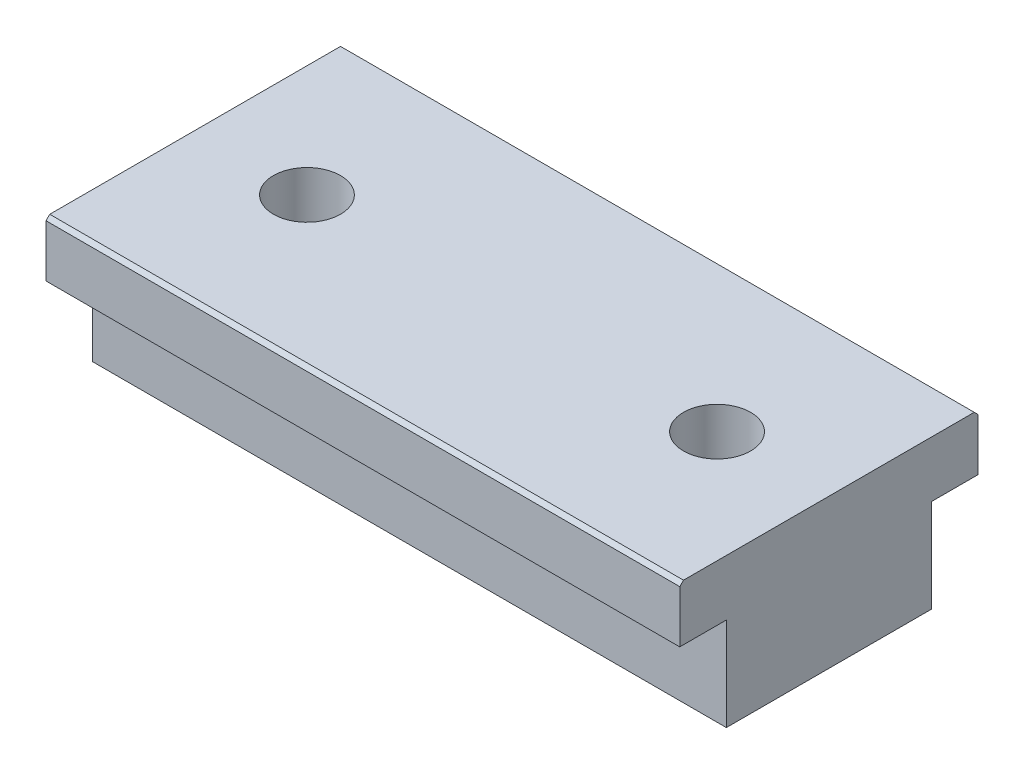
ISO-10303-21;
HEADER;
FILE_DESCRIPTION(('STEP AP214'),'2;1');
FILE_NAME('part.step','',(''),(''),'','','');
FILE_SCHEMA(('AUTOMOTIVE_DESIGN { 1 0 10303 214 1 1 1 1 }'));
ENDSEC;
DATA;
#1=APPLICATION_CONTEXT('core data for automotive mechanical design processes');
#2=APPLICATION_PROTOCOL_DEFINITION('international standard','automotive_design',2000,#1);
#3=PRODUCT_CONTEXT('',#1,'mechanical');
#4=PRODUCT('Part','Part','',(#3));
#5=PRODUCT_RELATED_PRODUCT_CATEGORY('part','',(#4));
#6=PRODUCT_DEFINITION_FORMATION('','',#4);
#7=PRODUCT_DEFINITION_CONTEXT('part definition',#1,'design');
#8=PRODUCT_DEFINITION('design','',#6,#7);
#9=PRODUCT_DEFINITION_SHAPE('','',#8);
#10=(LENGTH_UNIT() NAMED_UNIT(*) SI_UNIT(.MILLI.,.METRE.));
#11=(NAMED_UNIT(*) PLANE_ANGLE_UNIT() SI_UNIT($,.RADIAN.));
#12=(NAMED_UNIT(*) SI_UNIT($,.STERADIAN.) SOLID_ANGLE_UNIT());
#13=UNCERTAINTY_MEASURE_WITH_UNIT(LENGTH_MEASURE(1.E-05),#10,'distance_accuracy_value','');
#14=(GEOMETRIC_REPRESENTATION_CONTEXT(3) GLOBAL_UNCERTAINTY_ASSIGNED_CONTEXT((#13)) GLOBAL_UNIT_ASSIGNED_CONTEXT((#10,
#11,#12)) REPRESENTATION_CONTEXT('',''));
#15=CARTESIAN_POINT('',(0.,0.,0.));
#16=DIRECTION('',(0.,0.,1.));
#17=DIRECTION('',(1.,0.,0.));
#18=AXIS2_PLACEMENT_3D('',#15,#16,#17);
#19=CARTESIAN_POINT('',(170.,-15.,0.));
#20=DIRECTION('',(0.,0.,-1.));
#21=DIRECTION('',(-1.,0.,0.));
#22=AXIS2_PLACEMENT_3D('',#19,#20,#21);
#23=PLANE('',#22);
#24=DIRECTION('',(0.,-1.,0.));
#25=VECTOR('',#24,1.);
#26=CARTESIAN_POINT('',(170.,-15.,0.));
#27=LINE('',#26,#25);
#28=CARTESIAN_POINT('',(170.,-1.,0.));
#29=VERTEX_POINT('',#28);
#30=CARTESIAN_POINT('',(170.,-15.,0.));
#31=VERTEX_POINT('',#30);
#32=EDGE_CURVE('E112',#29,#31,#27,.T.);
#33=ORIENTED_EDGE('',*,*,#32,.F.);
#34=DIRECTION('',(-1.,0.,0.));
#35=VECTOR('',#34,1.);
#36=CARTESIAN_POINT('',(170.,-1.,0.));
#37=LINE('',#36,#35);
#38=CARTESIAN_POINT('',(0.,-1.,0.));
#39=VERTEX_POINT('',#38);
#40=EDGE_CURVE('E11',#29,#39,#37,.T.);
#41=ORIENTED_EDGE('',*,*,#40,.T.);
#42=DIRECTION('',(0.,-1.,0.));
#43=VECTOR('',#42,1.);
#44=CARTESIAN_POINT('',(0.,-15.,0.));
#45=LINE('',#44,#43);
#46=CARTESIAN_POINT('',(0.,-15.,0.));
#47=VERTEX_POINT('',#46);
#48=EDGE_CURVE('E132',#39,#47,#45,.T.);
#49=ORIENTED_EDGE('',*,*,#48,.T.);
#50=DIRECTION('',(-1.,0.,0.));
#51=VECTOR('',#50,1.);
#52=CARTESIAN_POINT('',(170.,-15.,0.));
#53=LINE('',#52,#51);
#54=EDGE_CURVE('E125',#31,#47,#53,.T.);
#55=ORIENTED_EDGE('',*,*,#54,.F.);
#56=EDGE_LOOP('',(#33,#41,#49,#55));
#57=FACE_BOUND('',#56,.T.);
#58=ADVANCED_FACE('F35',(#57),#23,.F.);
#59=CARTESIAN_POINT('',(170.,-15.,-12.5));
#60=DIRECTION('',(0.,1.,0.));
#61=DIRECTION('',(0.,0.,1.));
#62=AXIS2_PLACEMENT_3D('',#59,#60,#61);
#63=PLANE('',#62);
#64=DIRECTION('',(0.,0.,-1.));
#65=VECTOR('',#64,1.);
#66=CARTESIAN_POINT('',(0.,-15.,-12.5));
#67=LINE('',#66,#65);
#68=CARTESIAN_POINT('',(0.,-15.,-12.5));
#69=VERTEX_POINT('',#68);
#70=EDGE_CURVE('E198',#47,#69,#67,.T.);
#71=ORIENTED_EDGE('',*,*,#70,.T.);
#72=DIRECTION('',(-1.,0.,0.));
#73=VECTOR('',#72,1.);
#74=CARTESIAN_POINT('',(170.,-15.,-12.5));
#75=LINE('',#74,#73);
#76=CARTESIAN_POINT('',(170.,-15.,-12.5));
#77=VERTEX_POINT('',#76);
#78=EDGE_CURVE('E127',#77,#69,#75,.T.);
#79=ORIENTED_EDGE('',*,*,#78,.F.);
#80=DIRECTION('',(0.,0.,-1.));
#81=VECTOR('',#80,1.);
#82=CARTESIAN_POINT('',(170.,-15.,-12.5));
#83=LINE('',#82,#81);
#84=EDGE_CURVE('E115',#31,#77,#83,.T.);
#85=ORIENTED_EDGE('',*,*,#84,.F.);
#86=ORIENTED_EDGE('',*,*,#54,.T.);
#87=EDGE_LOOP('',(#71,#79,#85,#86));
#88=FACE_BOUND('',#87,.T.);
#89=ADVANCED_FACE('F124',(#88),#63,.F.);
#90=CARTESIAN_POINT('',(170.,-40.,-12.5));
#91=DIRECTION('',(0.,0.,-1.));
#92=DIRECTION('',(-1.,0.,0.));
#93=AXIS2_PLACEMENT_3D('',#90,#91,#92);
#94=PLANE('',#93);
#95=DIRECTION('',(0.,-1.,0.));
#96=VECTOR('',#95,1.);
#97=CARTESIAN_POINT('',(0.,-40.,-12.5));
#98=LINE('',#97,#96);
#99=CARTESIAN_POINT('',(0.,-40.,-12.5));
#100=VERTEX_POINT('',#99);
#101=EDGE_CURVE('E196',#69,#100,#98,.T.);
#102=ORIENTED_EDGE('',*,*,#101,.T.);
#103=DIRECTION('',(-1.,0.,0.));
#104=VECTOR('',#103,1.);
#105=CARTESIAN_POINT('',(170.,-40.,-12.5));
#106=LINE('',#105,#104);
#107=CARTESIAN_POINT('',(170.,-40.,-12.5));
#108=VERTEX_POINT('',#107);
#109=EDGE_CURVE('E138',#108,#100,#106,.T.);
#110=ORIENTED_EDGE('',*,*,#109,.F.);
#111=DIRECTION('',(0.,-1.,0.));
#112=VECTOR('',#111,1.);
#113=CARTESIAN_POINT('',(170.,-40.,-12.5));
#114=LINE('',#113,#112);
#115=EDGE_CURVE('E129',#77,#108,#114,.T.);
#116=ORIENTED_EDGE('',*,*,#115,.F.);
#117=ORIENTED_EDGE('',*,*,#78,.T.);
#118=EDGE_LOOP('',(#102,#110,#116,#117));
#119=FACE_BOUND('',#118,.T.);
#120=ADVANCED_FACE('F264',(#119),#94,.F.);
#121=CARTESIAN_POINT('',(170.,-40.,-67.5));
#122=DIRECTION('',(0.,1.,0.));
#123=DIRECTION('',(0.,0.,1.));
#124=AXIS2_PLACEMENT_3D('',#121,#122,#123);
#125=PLANE('',#124);
#126=CARTESIAN_POINT('',(30.,-40.,-40.));
#127=DIRECTION('',(0.,1.,0.));
#128=DIRECTION('',(0.,0.,1.));
#129=AXIS2_PLACEMENT_3D('',#126,#127,#128);
#130=CIRCLE('',#129,5.50000000000001);
#131=CARTESIAN_POINT('',(30.,-40.,-34.5));
#132=VERTEX_POINT('',#131);
#133=EDGE_CURVE('E222',#132,#132,#130,.T.);
#134=ORIENTED_EDGE('',*,*,#133,.T.);
#135=EDGE_LOOP('',(#134));
#136=FACE_BOUND('',#135,.T.);
#137=CARTESIAN_POINT('',(140.,-40.,-40.));
#138=DIRECTION('',(0.,1.,0.));
#139=DIRECTION('',(0.,0.,1.));
#140=AXIS2_PLACEMENT_3D('',#137,#138,#139);
#141=CIRCLE('',#140,5.50000000000001);
#142=CARTESIAN_POINT('',(140.,-40.,-34.5));
#143=VERTEX_POINT('',#142);
#144=EDGE_CURVE('E202',#143,#143,#141,.T.);
#145=ORIENTED_EDGE('',*,*,#144,.T.);
#146=EDGE_LOOP('',(#145));
#147=FACE_BOUND('',#146,.T.);
#148=DIRECTION('',(0.,0.,-1.));
#149=VECTOR('',#148,1.);
#150=CARTESIAN_POINT('',(0.,-40.,-67.5));
#151=LINE('',#150,#149);
#152=CARTESIAN_POINT('',(0.,-40.,-67.5));
#153=VERTEX_POINT('',#152);
#154=EDGE_CURVE('E191',#100,#153,#151,.T.);
#155=ORIENTED_EDGE('',*,*,#154,.T.);
#156=DIRECTION('',(-1.,0.,0.));
#157=VECTOR('',#156,1.);
#158=CARTESIAN_POINT('',(170.,-40.,-67.5));
#159=LINE('',#158,#157);
#160=CARTESIAN_POINT('',(170.,-40.,-67.5));
#161=VERTEX_POINT('',#160);
#162=EDGE_CURVE('E182',#161,#153,#159,.T.);
#163=ORIENTED_EDGE('',*,*,#162,.F.);
#164=DIRECTION('',(0.,0.,-1.));
#165=VECTOR('',#164,1.);
#166=CARTESIAN_POINT('',(170.,-40.,-67.5));
#167=LINE('',#166,#165);
#168=EDGE_CURVE('E192',#108,#161,#167,.T.);
#169=ORIENTED_EDGE('',*,*,#168,.F.);
#170=ORIENTED_EDGE('',*,*,#109,.T.);
#171=EDGE_LOOP('',(#155,#163,#169,#170));
#172=FACE_BOUND('',#171,.T.);
#173=ADVANCED_FACE('F189',(#136,#147,#172),#125,.F.);
#174=CARTESIAN_POINT('',(170.,-15.,-67.5));
#175=DIRECTION('',(0.,0.,1.));
#176=DIRECTION('',(1.,0.,0.));
#177=AXIS2_PLACEMENT_3D('',#174,#175,#176);
#178=PLANE('',#177);
#179=DIRECTION('',(0.,1.,0.));
#180=VECTOR('',#179,1.);
#181=CARTESIAN_POINT('',(0.,-15.,-67.5));
#182=LINE('',#181,#180);
#183=CARTESIAN_POINT('',(0.,-15.,-67.5));
#184=VERTEX_POINT('',#183);
#185=EDGE_CURVE('E174',#153,#184,#182,.T.);
#186=ORIENTED_EDGE('',*,*,#185,.T.);
#187=DIRECTION('',(-1.,0.,0.));
#188=VECTOR('',#187,1.);
#189=CARTESIAN_POINT('',(170.,-15.,-67.5));
#190=LINE('',#189,#188);
#191=CARTESIAN_POINT('',(170.,-15.,-67.5));
#192=VERTEX_POINT('',#191);
#193=EDGE_CURVE('E179',#192,#184,#190,.T.);
#194=ORIENTED_EDGE('',*,*,#193,.F.);
#195=DIRECTION('',(0.,1.,0.));
#196=VECTOR('',#195,1.);
#197=CARTESIAN_POINT('',(170.,-15.,-67.5));
#198=LINE('',#197,#196);
#199=EDGE_CURVE('E207',#161,#192,#198,.T.);
#200=ORIENTED_EDGE('',*,*,#199,.F.);
#201=ORIENTED_EDGE('',*,*,#162,.T.);
#202=EDGE_LOOP('',(#186,#194,#200,#201));
#203=FACE_BOUND('',#202,.T.);
#204=ADVANCED_FACE('F320',(#203),#178,.F.);
#205=CARTESIAN_POINT('',(170.,-15.,-80.));
#206=DIRECTION('',(0.,1.,0.));
#207=DIRECTION('',(0.,0.,1.));
#208=AXIS2_PLACEMENT_3D('',#205,#206,#207);
#209=PLANE('',#208);
#210=DIRECTION('',(0.,0.,-1.));
#211=VECTOR('',#210,1.);
#212=CARTESIAN_POINT('',(0.,-15.,-80.));
#213=LINE('',#212,#211);
#214=CARTESIAN_POINT('',(0.,-15.,-80.));
#215=VERTEX_POINT('',#214);
#216=EDGE_CURVE('E171',#184,#215,#213,.T.);
#217=ORIENTED_EDGE('',*,*,#216,.T.);
#218=DIRECTION('',(-1.,0.,0.));
#219=VECTOR('',#218,1.);
#220=CARTESIAN_POINT('',(170.,-15.,-80.));
#221=LINE('',#220,#219);
#222=CARTESIAN_POINT('',(170.,-15.,-80.));
#223=VERTEX_POINT('',#222);
#224=EDGE_CURVE('E160',#223,#215,#221,.T.);
#225=ORIENTED_EDGE('',*,*,#224,.F.);
#226=DIRECTION('',(0.,0.,-1.));
#227=VECTOR('',#226,1.);
#228=CARTESIAN_POINT('',(170.,-15.,-80.));
#229=LINE('',#228,#227);
#230=EDGE_CURVE('E205',#192,#223,#229,.T.);
#231=ORIENTED_EDGE('',*,*,#230,.F.);
#232=ORIENTED_EDGE('',*,*,#193,.T.);
#233=EDGE_LOOP('',(#217,#225,#231,#232));
#234=FACE_BOUND('',#233,.T.);
#235=ADVANCED_FACE('F330',(#234),#209,.F.);
#236=CARTESIAN_POINT('',(170.,0.,-80.));
#237=DIRECTION('',(0.,0.,1.));
#238=DIRECTION('',(1.,0.,0.));
#239=AXIS2_PLACEMENT_3D('',#236,#237,#238);
#240=PLANE('',#239);
#241=DIRECTION('',(0.,1.,0.));
#242=VECTOR('',#241,1.);
#243=CARTESIAN_POINT('',(0.,0.,-80.));
#244=LINE('',#243,#242);
#245=CARTESIAN_POINT('',(0.,-1.00000000000006,-80.));
#246=VERTEX_POINT('',#245);
#247=EDGE_CURVE('E167',#215,#246,#244,.T.);
#248=ORIENTED_EDGE('',*,*,#247,.T.);
#249=DIRECTION('',(1.,0.,0.));
#250=VECTOR('',#249,1.);
#251=CARTESIAN_POINT('',(170.,-1.00000000000006,-80.));
#252=LINE('',#251,#250);
#253=CARTESIAN_POINT('',(170.,-1.00000000000006,-80.));
#254=VERTEX_POINT('',#253);
#255=EDGE_CURVE('E58',#246,#254,#252,.T.);
#256=ORIENTED_EDGE('',*,*,#255,.T.);
#257=DIRECTION('',(0.,1.,0.));
#258=VECTOR('',#257,1.);
#259=CARTESIAN_POINT('',(170.,0.,-80.));
#260=LINE('',#259,#258);
#261=EDGE_CURVE('E152',#223,#254,#260,.T.);
#262=ORIENTED_EDGE('',*,*,#261,.F.);
#263=ORIENTED_EDGE('',*,*,#224,.T.);
#264=EDGE_LOOP('',(#248,#256,#262,#263));
#265=FACE_BOUND('',#264,.T.);
#266=ADVANCED_FACE('F169',(#265),#240,.F.);
#267=CARTESIAN_POINT('',(170.,0.,0.));
#268=DIRECTION('',(0.,-1.,0.));
#269=DIRECTION('',(0.,0.,-1.));
#270=AXIS2_PLACEMENT_3D('',#267,#268,#269);
#271=PLANE('',#270);
#272=CARTESIAN_POINT('',(30.,0.,-40.));
#273=DIRECTION('',(0.,1.,0.));
#274=DIRECTION('',(0.,0.,1.));
#275=AXIS2_PLACEMENT_3D('',#272,#273,#274);
#276=CIRCLE('',#275,9.00000000000001);
#277=CARTESIAN_POINT('',(30.,0.,-31.));
#278=VERTEX_POINT('',#277);
#279=EDGE_CURVE('E231',#278,#278,#276,.T.);
#280=ORIENTED_EDGE('',*,*,#279,.F.);
#281=EDGE_LOOP('',(#280));
#282=FACE_BOUND('',#281,.T.);
#283=CARTESIAN_POINT('',(140.,0.,-40.));
#284=DIRECTION('',(0.,1.,0.));
#285=DIRECTION('',(0.,0.,1.));
#286=AXIS2_PLACEMENT_3D('',#283,#284,#285);
#287=CIRCLE('',#286,9.00000000000001);
#288=CARTESIAN_POINT('',(140.,0.,-31.));
#289=VERTEX_POINT('',#288);
#290=EDGE_CURVE('E219',#289,#289,#287,.T.);
#291=ORIENTED_EDGE('',*,*,#290,.F.);
#292=EDGE_LOOP('',(#291));
#293=FACE_BOUND('',#292,.T.);
#294=DIRECTION('',(0.,0.,1.));
#295=VECTOR('',#294,1.);
#296=CARTESIAN_POINT('',(170.,0.,0.));
#297=LINE('',#296,#295);
#298=CARTESIAN_POINT('',(170.,0.,-78.9999999999999));
#299=VERTEX_POINT('',#298);
#300=CARTESIAN_POINT('',(170.,0.,-1.));
#301=VERTEX_POINT('',#300);
#302=EDGE_CURVE('E151',#299,#301,#297,.T.);
#303=ORIENTED_EDGE('',*,*,#302,.F.);
#304=DIRECTION('',(-1.,0.,0.));
#305=VECTOR('',#304,1.);
#306=CARTESIAN_POINT('',(170.,0.,-78.9999999999999));
#307=LINE('',#306,#305);
#308=CARTESIAN_POINT('',(0.,0.,-78.9999999999999));
#309=VERTEX_POINT('',#308);
#310=EDGE_CURVE('E136',#299,#309,#307,.T.);
#311=ORIENTED_EDGE('',*,*,#310,.T.);
#312=DIRECTION('',(0.,0.,1.));
#313=VECTOR('',#312,1.);
#314=CARTESIAN_POINT('',(0.,0.,0.));
#315=LINE('',#314,#313);
#316=CARTESIAN_POINT('',(0.,0.,-1.));
#317=VERTEX_POINT('',#316);
#318=EDGE_CURVE('E120',#309,#317,#315,.T.);
#319=ORIENTED_EDGE('',*,*,#318,.T.);
#320=DIRECTION('',(1.,0.,0.));
#321=VECTOR('',#320,1.);
#322=CARTESIAN_POINT('',(170.,0.,-1.));
#323=LINE('',#322,#321);
#324=EDGE_CURVE('E134',#317,#301,#323,.T.);
#325=ORIENTED_EDGE('',*,*,#324,.T.);
#326=EDGE_LOOP('',(#303,#311,#319,#325));
#327=FACE_BOUND('',#326,.T.);
#328=ADVANCED_FACE('F156',(#282,#293,#327),#271,.F.);
#329=CARTESIAN_POINT('',(170.,0.,0.));
#330=DIRECTION('',(-1.,0.,0.));
#331=DIRECTION('',(0.,0.,1.));
#332=AXIS2_PLACEMENT_3D('',#329,#330,#331);
#333=PLANE('',#332);
#334=ORIENTED_EDGE('',*,*,#261,.T.);
#335=DIRECTION('',(0.,-0.707106781186548,-0.707106781186548));
#336=VECTOR('',#335,1.);
#337=CARTESIAN_POINT('',(170.,0.,-78.9999999999999));
#338=LINE('',#337,#336);
#339=EDGE_CURVE('E43',#254,#299,#338,.F.);
#340=ORIENTED_EDGE('',*,*,#339,.T.);
#341=ORIENTED_EDGE('',*,*,#302,.T.);
#342=DIRECTION('',(0.,0.707106781186548,-0.707106781186548));
#343=VECTOR('',#342,1.);
#344=CARTESIAN_POINT('',(170.,-1.,0.));
#345=LINE('',#344,#343);
#346=EDGE_CURVE('E50',#301,#29,#345,.F.);
#347=ORIENTED_EDGE('',*,*,#346,.T.);
#348=ORIENTED_EDGE('',*,*,#32,.T.);
#349=ORIENTED_EDGE('',*,*,#84,.T.);
#350=ORIENTED_EDGE('',*,*,#115,.T.);
#351=ORIENTED_EDGE('',*,*,#168,.T.);
#352=ORIENTED_EDGE('',*,*,#199,.T.);
#353=ORIENTED_EDGE('',*,*,#230,.T.);
#354=EDGE_LOOP('',(#334,#340,#341,#347,#348,#349,#350,#351,#352,#353));
#355=FACE_BOUND('',#354,.T.);
#356=ADVANCED_FACE('F114',(#355),#333,.F.);
#357=CARTESIAN_POINT('',(0.,0.,0.));
#358=DIRECTION('',(-1.,0.,0.));
#359=DIRECTION('',(0.,0.,1.));
#360=AXIS2_PLACEMENT_3D('',#357,#358,#359);
#361=PLANE('',#360);
#362=ORIENTED_EDGE('',*,*,#318,.F.);
#363=DIRECTION('',(0.,0.707106781186548,0.707106781186548));
#364=VECTOR('',#363,1.);
#365=CARTESIAN_POINT('',(0.,39.5,-39.5));
#366=LINE('',#365,#364);
#367=EDGE_CURVE('E146',#309,#246,#366,.F.);
#368=ORIENTED_EDGE('',*,*,#367,.T.);
#369=ORIENTED_EDGE('',*,*,#247,.F.);
#370=ORIENTED_EDGE('',*,*,#216,.F.);
#371=ORIENTED_EDGE('',*,*,#185,.F.);
#372=ORIENTED_EDGE('',*,*,#154,.F.);
#373=ORIENTED_EDGE('',*,*,#101,.F.);
#374=ORIENTED_EDGE('',*,*,#70,.F.);
#375=ORIENTED_EDGE('',*,*,#48,.F.);
#376=DIRECTION('',(0.,-0.707106781186548,0.707106781186548));
#377=VECTOR('',#376,1.);
#378=CARTESIAN_POINT('',(0.,-0.5,-0.5));
#379=LINE('',#378,#377);
#380=EDGE_CURVE('E144',#39,#317,#379,.F.);
#381=ORIENTED_EDGE('',*,*,#380,.T.);
#382=EDGE_LOOP('',(#362,#368,#369,#370,#371,#372,#373,#374,#375,#381));
#383=FACE_BOUND('',#382,.T.);
#384=ADVANCED_FACE('F165',(#383),#361,.T.);
#385=CARTESIAN_POINT('',(140.,0.,-40.));
#386=DIRECTION('',(0.,1.,0.));
#387=DIRECTION('',(0.,0.,1.));
#388=AXIS2_PLACEMENT_3D('',#385,#386,#387);
#389=CYLINDRICAL_SURFACE('',#388,5.50000000000001);
#390=ORIENTED_EDGE('',*,*,#144,.F.);
#391=EDGE_LOOP('',(#390));
#392=FACE_BOUND('',#391,.T.);
#393=CARTESIAN_POINT('',(140.,-15.,-40.));
#394=DIRECTION('',(0.,1.,0.));
#395=DIRECTION('',(0.,0.,1.));
#396=AXIS2_PLACEMENT_3D('',#393,#394,#395);
#397=CIRCLE('',#396,5.50000000000001);
#398=CARTESIAN_POINT('',(140.,-15.,-34.5));
#399=VERTEX_POINT('',#398);
#400=EDGE_CURVE('E213',#399,#399,#397,.T.);
#401=ORIENTED_EDGE('',*,*,#400,.T.);
#402=EDGE_LOOP('',(#401));
#403=FACE_BOUND('',#402,.T.);
#404=ADVANCED_FACE('F255',(#392,#403),#389,.F.);
#405=CARTESIAN_POINT('',(145.5,-15.,-40.));
#406=DIRECTION('',(0.,-1.,0.));
#407=DIRECTION('',(0.,0.,-1.));
#408=AXIS2_PLACEMENT_3D('',#405,#406,#407);
#409=PLANE('',#408);
#410=ORIENTED_EDGE('',*,*,#400,.F.);
#411=EDGE_LOOP('',(#410));
#412=FACE_BOUND('',#411,.T.);
#413=CARTESIAN_POINT('',(140.,-15.,-40.));
#414=DIRECTION('',(0.,1.,0.));
#415=DIRECTION('',(0.,0.,1.));
#416=AXIS2_PLACEMENT_3D('',#413,#414,#415);
#417=CIRCLE('',#416,9.00000000000001);
#418=CARTESIAN_POINT('',(140.,-15.,-31.));
#419=VERTEX_POINT('',#418);
#420=EDGE_CURVE('E216',#419,#419,#417,.T.);
#421=ORIENTED_EDGE('',*,*,#420,.T.);
#422=EDGE_LOOP('',(#421));
#423=FACE_BOUND('',#422,.T.);
#424=ADVANCED_FACE('F245',(#412,#423),#409,.F.);
#425=CARTESIAN_POINT('',(140.,0.,-40.));
#426=DIRECTION('',(0.,1.,0.));
#427=DIRECTION('',(0.,0.,1.));
#428=AXIS2_PLACEMENT_3D('',#425,#426,#427);
#429=CYLINDRICAL_SURFACE('',#428,9.00000000000001);
#430=ORIENTED_EDGE('',*,*,#420,.F.);
#431=EDGE_LOOP('',(#430));
#432=FACE_BOUND('',#431,.T.);
#433=ORIENTED_EDGE('',*,*,#290,.T.);
#434=EDGE_LOOP('',(#433));
#435=FACE_BOUND('',#434,.T.);
#436=ADVANCED_FACE('F242',(#432,#435),#429,.F.);
#437=CARTESIAN_POINT('',(30.,0.,-40.));
#438=DIRECTION('',(0.,1.,0.));
#439=DIRECTION('',(0.,0.,1.));
#440=AXIS2_PLACEMENT_3D('',#437,#438,#439);
#441=CYLINDRICAL_SURFACE('',#440,5.50000000000001);
#442=ORIENTED_EDGE('',*,*,#133,.F.);
#443=EDGE_LOOP('',(#442));
#444=FACE_BOUND('',#443,.T.);
#445=CARTESIAN_POINT('',(30.,-15.,-40.));
#446=DIRECTION('',(0.,1.,0.));
#447=DIRECTION('',(0.,0.,1.));
#448=AXIS2_PLACEMENT_3D('',#445,#446,#447);
#449=CIRCLE('',#448,5.50000000000001);
#450=CARTESIAN_POINT('',(30.,-15.,-34.5));
#451=VERTEX_POINT('',#450);
#452=EDGE_CURVE('E225',#451,#451,#449,.T.);
#453=ORIENTED_EDGE('',*,*,#452,.T.);
#454=EDGE_LOOP('',(#453));
#455=FACE_BOUND('',#454,.T.);
#456=ADVANCED_FACE('F244',(#444,#455),#441,.F.);
#457=CARTESIAN_POINT('',(35.5,-15.,-40.));
#458=DIRECTION('',(0.,-1.,0.));
#459=DIRECTION('',(0.,0.,-1.));
#460=AXIS2_PLACEMENT_3D('',#457,#458,#459);
#461=PLANE('',#460);
#462=ORIENTED_EDGE('',*,*,#452,.F.);
#463=EDGE_LOOP('',(#462));
#464=FACE_BOUND('',#463,.T.);
#465=CARTESIAN_POINT('',(30.,-15.,-40.));
#466=DIRECTION('',(0.,1.,0.));
#467=DIRECTION('',(0.,0.,1.));
#468=AXIS2_PLACEMENT_3D('',#465,#466,#467);
#469=CIRCLE('',#468,9.00000000000001);
#470=CARTESIAN_POINT('',(30.,-15.,-31.));
#471=VERTEX_POINT('',#470);
#472=EDGE_CURVE('E228',#471,#471,#469,.T.);
#473=ORIENTED_EDGE('',*,*,#472,.T.);
#474=EDGE_LOOP('',(#473));
#475=FACE_BOUND('',#474,.T.);
#476=ADVANCED_FACE('F252',(#464,#475),#461,.F.);
#477=CARTESIAN_POINT('',(30.,0.,-40.));
#478=DIRECTION('',(0.,1.,0.));
#479=DIRECTION('',(0.,0.,1.));
#480=AXIS2_PLACEMENT_3D('',#477,#478,#479);
#481=CYLINDRICAL_SURFACE('',#480,9.00000000000001);
#482=ORIENTED_EDGE('',*,*,#472,.F.);
#483=EDGE_LOOP('',(#482));
#484=FACE_BOUND('',#483,.T.);
#485=ORIENTED_EDGE('',*,*,#279,.T.);
#486=EDGE_LOOP('',(#485));
#487=FACE_BOUND('',#486,.T.);
#488=ADVANCED_FACE('F235',(#484,#487),#481,.F.);
#489=CARTESIAN_POINT('',(170.,0.,-78.9999999999999));
#490=DIRECTION('',(0.,-0.707106781186548,0.707106781186548));
#491=DIRECTION('',(-1.,0.,0.));
#492=AXIS2_PLACEMENT_3D('',#489,#490,#491);
#493=PLANE('',#492);
#494=ORIENTED_EDGE('',*,*,#339,.F.);
#495=ORIENTED_EDGE('',*,*,#255,.F.);
#496=ORIENTED_EDGE('',*,*,#367,.F.);
#497=ORIENTED_EDGE('',*,*,#310,.F.);
#498=EDGE_LOOP('',(#494,#495,#496,#497));
#499=FACE_BOUND('',#498,.T.);
#500=ADVANCED_FACE('F162',(#499),#493,.F.);
#501=CARTESIAN_POINT('',(170.,-1.,0.));
#502=DIRECTION('',(0.,-0.707106781186547,-0.707106781186547));
#503=DIRECTION('',(-1.,0.,0.));
#504=AXIS2_PLACEMENT_3D('',#501,#502,#503);
#505=PLANE('',#504);
#506=ORIENTED_EDGE('',*,*,#346,.F.);
#507=ORIENTED_EDGE('',*,*,#324,.F.);
#508=ORIENTED_EDGE('',*,*,#380,.F.);
#509=ORIENTED_EDGE('',*,*,#40,.F.);
#510=EDGE_LOOP('',(#506,#507,#508,#509));
#511=FACE_BOUND('',#510,.T.);
#512=ADVANCED_FACE('F37',(#511),#505,.F.);
#513=CLOSED_SHELL('',(#58,#89,#120,#173,#204,#235,#266,#328,#356,#384,#404,#424,#436,#456,#476,
#488,#500,#512));
#514=MANIFOLD_SOLID_BREP('B2',#513);
#515=ADVANCED_BREP_SHAPE_REPRESENTATION('',(#18,#514),#14);
#516=SHAPE_DEFINITION_REPRESENTATION(#9,#515);
ENDSEC;
END-ISO-10303-21;
